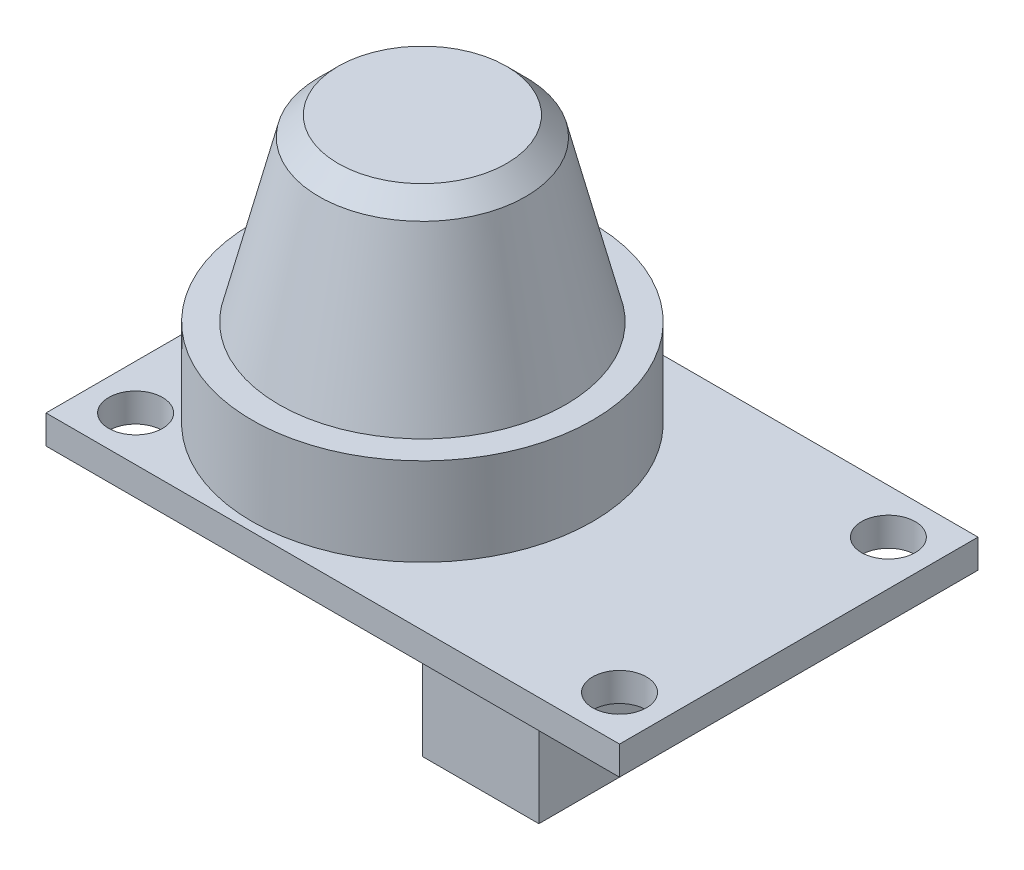
ISO-10303-21;
HEADER;
FILE_DESCRIPTION(('STEP AP214'),'2;1');
FILE_NAME('part.step','',(''),(''),'','','');
FILE_SCHEMA(('AUTOMOTIVE_DESIGN { 1 0 10303 214 1 1 1 1 }'));
ENDSEC;
DATA;
#1=APPLICATION_CONTEXT('core data for automotive mechanical design processes');
#2=APPLICATION_PROTOCOL_DEFINITION('international standard','automotive_design',2000,#1);
#3=PRODUCT_CONTEXT('',#1,'mechanical');
#4=PRODUCT('Part','Part','',(#3));
#5=PRODUCT_RELATED_PRODUCT_CATEGORY('part','',(#4));
#6=PRODUCT_DEFINITION_FORMATION('','',#4);
#7=PRODUCT_DEFINITION_CONTEXT('part definition',#1,'design');
#8=PRODUCT_DEFINITION('design','',#6,#7);
#9=PRODUCT_DEFINITION_SHAPE('','',#8);
#10=(LENGTH_UNIT() NAMED_UNIT(*) SI_UNIT(.MILLI.,.METRE.));
#11=(NAMED_UNIT(*) PLANE_ANGLE_UNIT() SI_UNIT($,.RADIAN.));
#12=(NAMED_UNIT(*) SI_UNIT($,.STERADIAN.) SOLID_ANGLE_UNIT());
#13=UNCERTAINTY_MEASURE_WITH_UNIT(LENGTH_MEASURE(1.E-05),#10,'distance_accuracy_value','');
#14=(GEOMETRIC_REPRESENTATION_CONTEXT(3) GLOBAL_UNCERTAINTY_ASSIGNED_CONTEXT((#13)) GLOBAL_UNIT_ASSIGNED_CONTEXT((#10,
#11,#12)) REPRESENTATION_CONTEXT('',''));
#15=CARTESIAN_POINT('',(0.,0.,0.));
#16=DIRECTION('',(0.,0.,1.));
#17=DIRECTION('',(1.,0.,0.));
#18=AXIS2_PLACEMENT_3D('',#15,#16,#17);
#19=CARTESIAN_POINT('',(0.,0.,0.));
#20=DIRECTION('',(0.,1.,0.));
#21=DIRECTION('',(0.,0.,1.));
#22=AXIS2_PLACEMENT_3D('',#19,#20,#21);
#23=PLANE('',#22);
#24=CARTESIAN_POINT('',(13.5,0.,7.5));
#25=DIRECTION('',(0.,1.,0.));
#26=DIRECTION('',(0.,0.,1.));
#27=AXIS2_PLACEMENT_3D('',#24,#25,#26);
#28=CIRCLE('',#27,1.5);
#29=CARTESIAN_POINT('',(13.5,0.,9.));
#30=VERTEX_POINT('',#29);
#31=EDGE_CURVE('E128',#30,#30,#28,.T.);
#32=ORIENTED_EDGE('',*,*,#31,.T.);
#33=EDGE_LOOP('',(#32));
#34=FACE_BOUND('',#33,.T.);
#35=CARTESIAN_POINT('',(-13.5,0.,7.5));
#36=DIRECTION('',(0.,1.,0.));
#37=DIRECTION('',(0.,0.,1.));
#38=AXIS2_PLACEMENT_3D('',#35,#36,#37);
#39=CIRCLE('',#38,1.5);
#40=CARTESIAN_POINT('',(-13.5,0.,9.));
#41=VERTEX_POINT('',#40);
#42=EDGE_CURVE('E138',#41,#41,#39,.T.);
#43=ORIENTED_EDGE('',*,*,#42,.T.);
#44=EDGE_LOOP('',(#43));
#45=FACE_BOUND('',#44,.T.);
#46=CARTESIAN_POINT('',(13.5,0.,-7.5));
#47=DIRECTION('',(0.,1.,0.));
#48=DIRECTION('',(0.,0.,1.));
#49=AXIS2_PLACEMENT_3D('',#46,#47,#48);
#50=CIRCLE('',#49,1.5);
#51=CARTESIAN_POINT('',(13.5,0.,-6.));
#52=VERTEX_POINT('',#51);
#53=EDGE_CURVE('E143',#52,#52,#50,.T.);
#54=ORIENTED_EDGE('',*,*,#53,.T.);
#55=EDGE_LOOP('',(#54));
#56=FACE_BOUND('',#55,.T.);
#57=CARTESIAN_POINT('',(-13.5,0.,-7.5));
#58=DIRECTION('',(0.,1.,0.));
#59=DIRECTION('',(0.,0.,1.));
#60=AXIS2_PLACEMENT_3D('',#57,#58,#59);
#61=CIRCLE('',#60,1.5);
#62=CARTESIAN_POINT('',(-13.5,0.,-6.));
#63=VERTEX_POINT('',#62);
#64=EDGE_CURVE('E149',#63,#63,#61,.T.);
#65=ORIENTED_EDGE('',*,*,#64,.T.);
#66=EDGE_LOOP('',(#65));
#67=FACE_BOUND('',#66,.T.);
#68=DIRECTION('',(0.,0.,-1.));
#69=VECTOR('',#68,1.);
#70=CARTESIAN_POINT('',(16.,0.,-10.));
#71=LINE('',#70,#69);
#72=CARTESIAN_POINT('',(16.,0.,10.));
#73=VERTEX_POINT('',#72);
#74=CARTESIAN_POINT('',(16.,0.,-10.));
#75=VERTEX_POINT('',#74);
#76=EDGE_CURVE('E155',#73,#75,#71,.T.);
#77=ORIENTED_EDGE('',*,*,#76,.F.);
#78=DIRECTION('',(1.,0.,0.));
#79=VECTOR('',#78,1.);
#80=CARTESIAN_POINT('',(-16.,0.,10.));
#81=LINE('',#80,#79);
#82=CARTESIAN_POINT('',(-16.,0.,10.));
#83=VERTEX_POINT('',#82);
#84=EDGE_CURVE('E162',#83,#73,#81,.T.);
#85=ORIENTED_EDGE('',*,*,#84,.F.);
#86=DIRECTION('',(0.,0.,1.));
#87=VECTOR('',#86,1.);
#88=CARTESIAN_POINT('',(-16.,0.,-10.));
#89=LINE('',#88,#87);
#90=CARTESIAN_POINT('',(-16.,0.,-10.));
#91=VERTEX_POINT('',#90);
#92=EDGE_CURVE('E173',#91,#83,#89,.T.);
#93=ORIENTED_EDGE('',*,*,#92,.F.);
#94=DIRECTION('',(-1.,0.,0.));
#95=VECTOR('',#94,1.);
#96=CARTESIAN_POINT('',(-16.,0.,-10.));
#97=LINE('',#96,#95);
#98=EDGE_CURVE('E171',#75,#91,#97,.T.);
#99=ORIENTED_EDGE('',*,*,#98,.F.);
#100=EDGE_LOOP('',(#77,#85,#93,#99));
#101=FACE_BOUND('',#100,.T.);
#102=DIRECTION('',(0.,0.,1.));
#103=VECTOR('',#102,1.);
#104=CARTESIAN_POINT('',(11.,0.,0.));
#105=LINE('',#104,#103);
#106=CARTESIAN_POINT('',(11.,0.,3.));
#107=VERTEX_POINT('',#106);
#108=CARTESIAN_POINT('',(11.,0.,9.5));
#109=VERTEX_POINT('',#108);
#110=EDGE_CURVE('E127',#107,#109,#105,.T.);
#111=ORIENTED_EDGE('',*,*,#110,.F.);
#112=DIRECTION('',(1.,0.,0.));
#113=VECTOR('',#112,1.);
#114=CARTESIAN_POINT('',(0.,0.,3.));
#115=LINE('',#114,#113);
#116=CARTESIAN_POINT('',(4.5,0.,3.));
#117=VERTEX_POINT('',#116);
#118=EDGE_CURVE('E124',#117,#107,#115,.T.);
#119=ORIENTED_EDGE('',*,*,#118,.F.);
#120=DIRECTION('',(0.,0.,-1.));
#121=VECTOR('',#120,1.);
#122=CARTESIAN_POINT('',(4.5,0.,0.));
#123=LINE('',#122,#121);
#124=CARTESIAN_POINT('',(4.5,0.,9.5));
#125=VERTEX_POINT('',#124);
#126=EDGE_CURVE('E62',#125,#117,#123,.T.);
#127=ORIENTED_EDGE('',*,*,#126,.F.);
#128=DIRECTION('',(-1.,0.,0.));
#129=VECTOR('',#128,1.);
#130=CARTESIAN_POINT('',(0.,0.,9.5));
#131=LINE('',#130,#129);
#132=EDGE_CURVE('E57',#109,#125,#131,.T.);
#133=ORIENTED_EDGE('',*,*,#132,.F.);
#134=EDGE_LOOP('',(#111,#119,#127,#133));
#135=FACE_BOUND('',#134,.T.);
#136=ADVANCED_FACE('F41',(#34,#45,#56,#67,#101,#135),#23,.F.);
#137=CARTESIAN_POINT('',(0.,1.6,0.));
#138=DIRECTION('',(0.,1.,0.));
#139=DIRECTION('',(0.,0.,1.));
#140=AXIS2_PLACEMENT_3D('',#137,#138,#139);
#141=PLANE('',#140);
#142=CARTESIAN_POINT('',(-5.,1.6,0.));
#143=DIRECTION('',(0.,1.,0.));
#144=DIRECTION('',(0.,0.,1.));
#145=AXIS2_PLACEMENT_3D('',#142,#143,#144);
#146=CIRCLE('',#145,9.5);
#147=CARTESIAN_POINT('',(-5.,1.6,9.5));
#148=VERTEX_POINT('',#147);
#149=EDGE_CURVE('E45',#148,#148,#146,.F.);
#150=ORIENTED_EDGE('',*,*,#149,.T.);
#151=EDGE_LOOP('',(#150));
#152=FACE_BOUND('',#151,.T.);
#153=CARTESIAN_POINT('',(-13.5,1.6,7.5));
#154=DIRECTION('',(0.,1.,0.));
#155=DIRECTION('',(0.,0.,1.));
#156=AXIS2_PLACEMENT_3D('',#153,#154,#155);
#157=CIRCLE('',#156,1.5);
#158=CARTESIAN_POINT('',(-13.5,1.6,9.));
#159=VERTEX_POINT('',#158);
#160=EDGE_CURVE('E140',#159,#159,#157,.T.);
#161=ORIENTED_EDGE('',*,*,#160,.F.);
#162=EDGE_LOOP('',(#161));
#163=FACE_BOUND('',#162,.T.);
#164=CARTESIAN_POINT('',(-13.5,1.6,-7.5));
#165=DIRECTION('',(0.,1.,0.));
#166=DIRECTION('',(0.,0.,1.));
#167=AXIS2_PLACEMENT_3D('',#164,#165,#166);
#168=CIRCLE('',#167,1.5);
#169=CARTESIAN_POINT('',(-13.5,1.6,-6.));
#170=VERTEX_POINT('',#169);
#171=EDGE_CURVE('E152',#170,#170,#168,.T.);
#172=ORIENTED_EDGE('',*,*,#171,.F.);
#173=EDGE_LOOP('',(#172));
#174=FACE_BOUND('',#173,.T.);
#175=DIRECTION('',(0.,0.,-1.));
#176=VECTOR('',#175,1.);
#177=CARTESIAN_POINT('',(16.,1.6,-10.));
#178=LINE('',#177,#176);
#179=CARTESIAN_POINT('',(16.,1.6,10.));
#180=VERTEX_POINT('',#179);
#181=CARTESIAN_POINT('',(16.,1.6,-10.));
#182=VERTEX_POINT('',#181);
#183=EDGE_CURVE('E158',#180,#182,#178,.T.);
#184=ORIENTED_EDGE('',*,*,#183,.T.);
#185=DIRECTION('',(-1.,0.,0.));
#186=VECTOR('',#185,1.);
#187=CARTESIAN_POINT('',(-16.,1.6,-10.));
#188=LINE('',#187,#186);
#189=CARTESIAN_POINT('',(-16.,1.6,-10.));
#190=VERTEX_POINT('',#189);
#191=EDGE_CURVE('E161',#182,#190,#188,.T.);
#192=ORIENTED_EDGE('',*,*,#191,.T.);
#193=DIRECTION('',(0.,0.,1.));
#194=VECTOR('',#193,1.);
#195=CARTESIAN_POINT('',(-16.,1.6,-10.));
#196=LINE('',#195,#194);
#197=CARTESIAN_POINT('',(-16.,1.6,10.));
#198=VERTEX_POINT('',#197);
#199=EDGE_CURVE('E164',#190,#198,#196,.T.);
#200=ORIENTED_EDGE('',*,*,#199,.T.);
#201=DIRECTION('',(1.,0.,0.));
#202=VECTOR('',#201,1.);
#203=CARTESIAN_POINT('',(-16.,1.6,10.));
#204=LINE('',#203,#202);
#205=EDGE_CURVE('E166',#198,#180,#204,.T.);
#206=ORIENTED_EDGE('',*,*,#205,.T.);
#207=EDGE_LOOP('',(#184,#192,#200,#206));
#208=FACE_BOUND('',#207,.T.);
#209=CARTESIAN_POINT('',(13.5,1.6,-7.5));
#210=DIRECTION('',(0.,1.,0.));
#211=DIRECTION('',(0.,0.,1.));
#212=AXIS2_PLACEMENT_3D('',#209,#210,#211);
#213=CIRCLE('',#212,1.5);
#214=CARTESIAN_POINT('',(13.5,1.6,-6.));
#215=VERTEX_POINT('',#214);
#216=EDGE_CURVE('E146',#215,#215,#213,.T.);
#217=ORIENTED_EDGE('',*,*,#216,.F.);
#218=EDGE_LOOP('',(#217));
#219=FACE_BOUND('',#218,.T.);
#220=CARTESIAN_POINT('',(13.5,1.6,7.5));
#221=DIRECTION('',(0.,1.,0.));
#222=DIRECTION('',(0.,0.,1.));
#223=AXIS2_PLACEMENT_3D('',#220,#221,#222);
#224=CIRCLE('',#223,1.5);
#225=CARTESIAN_POINT('',(13.5,1.6,9.));
#226=VERTEX_POINT('',#225);
#227=EDGE_CURVE('E131',#226,#226,#224,.T.);
#228=ORIENTED_EDGE('',*,*,#227,.F.);
#229=EDGE_LOOP('',(#228));
#230=FACE_BOUND('',#229,.T.);
#231=ADVANCED_FACE('F200',(#152,#163,#174,#208,#219,#230),#141,.T.);
#232=CARTESIAN_POINT('',(16.,1.6,-10.));
#233=DIRECTION('',(-1.,0.,0.));
#234=DIRECTION('',(0.,0.,1.));
#235=AXIS2_PLACEMENT_3D('',#232,#233,#234);
#236=PLANE('',#235);
#237=ORIENTED_EDGE('',*,*,#76,.T.);
#238=DIRECTION('',(0.,-1.,0.));
#239=VECTOR('',#238,1.);
#240=CARTESIAN_POINT('',(16.,1.6,-10.));
#241=LINE('',#240,#239);
#242=EDGE_CURVE('E11',#182,#75,#241,.T.);
#243=ORIENTED_EDGE('',*,*,#242,.F.);
#244=ORIENTED_EDGE('',*,*,#183,.F.);
#245=DIRECTION('',(0.,-1.,0.));
#246=VECTOR('',#245,1.);
#247=CARTESIAN_POINT('',(16.,1.6,10.));
#248=LINE('',#247,#246);
#249=EDGE_CURVE('E168',#180,#73,#248,.T.);
#250=ORIENTED_EDGE('',*,*,#249,.T.);
#251=EDGE_LOOP('',(#237,#243,#244,#250));
#252=FACE_BOUND('',#251,.T.);
#253=ADVANCED_FACE('F43',(#252),#236,.F.);
#254=CARTESIAN_POINT('',(-16.,1.6,-10.));
#255=DIRECTION('',(0.,0.,1.));
#256=DIRECTION('',(1.,0.,0.));
#257=AXIS2_PLACEMENT_3D('',#254,#255,#256);
#258=PLANE('',#257);
#259=ORIENTED_EDGE('',*,*,#98,.T.);
#260=DIRECTION('',(0.,-1.,0.));
#261=VECTOR('',#260,1.);
#262=CARTESIAN_POINT('',(-16.,1.6,-10.));
#263=LINE('',#262,#261);
#264=EDGE_CURVE('E50',#190,#91,#263,.T.);
#265=ORIENTED_EDGE('',*,*,#264,.F.);
#266=ORIENTED_EDGE('',*,*,#191,.F.);
#267=ORIENTED_EDGE('',*,*,#242,.T.);
#268=EDGE_LOOP('',(#259,#265,#266,#267));
#269=FACE_BOUND('',#268,.T.);
#270=ADVANCED_FACE('F202',(#269),#258,.F.);
#271=CARTESIAN_POINT('',(-16.,1.6,-10.));
#272=DIRECTION('',(1.,0.,0.));
#273=DIRECTION('',(0.,0.,-1.));
#274=AXIS2_PLACEMENT_3D('',#271,#272,#273);
#275=PLANE('',#274);
#276=ORIENTED_EDGE('',*,*,#92,.T.);
#277=DIRECTION('',(0.,-1.,0.));
#278=VECTOR('',#277,1.);
#279=CARTESIAN_POINT('',(-16.,1.6,10.));
#280=LINE('',#279,#278);
#281=EDGE_CURVE('E178',#198,#83,#280,.T.);
#282=ORIENTED_EDGE('',*,*,#281,.F.);
#283=ORIENTED_EDGE('',*,*,#199,.F.);
#284=ORIENTED_EDGE('',*,*,#264,.T.);
#285=EDGE_LOOP('',(#276,#282,#283,#284));
#286=FACE_BOUND('',#285,.T.);
#287=ADVANCED_FACE('F186',(#286),#275,.F.);
#288=CARTESIAN_POINT('',(-16.,1.6,10.));
#289=DIRECTION('',(0.,0.,-1.));
#290=DIRECTION('',(-1.,0.,0.));
#291=AXIS2_PLACEMENT_3D('',#288,#289,#290);
#292=PLANE('',#291);
#293=ORIENTED_EDGE('',*,*,#84,.T.);
#294=ORIENTED_EDGE('',*,*,#249,.F.);
#295=ORIENTED_EDGE('',*,*,#205,.F.);
#296=ORIENTED_EDGE('',*,*,#281,.T.);
#297=EDGE_LOOP('',(#293,#294,#295,#296));
#298=FACE_BOUND('',#297,.T.);
#299=ADVANCED_FACE('F194',(#298),#292,.F.);
#300=CARTESIAN_POINT('',(-13.5,1.6,-7.5));
#301=DIRECTION('',(0.,-1.,0.));
#302=DIRECTION('',(0.,0.,-1.));
#303=AXIS2_PLACEMENT_3D('',#300,#301,#302);
#304=CYLINDRICAL_SURFACE('',#303,1.5);
#305=ORIENTED_EDGE('',*,*,#171,.T.);
#306=EDGE_LOOP('',(#305));
#307=FACE_BOUND('',#306,.T.);
#308=ORIENTED_EDGE('',*,*,#64,.F.);
#309=EDGE_LOOP('',(#308));
#310=FACE_BOUND('',#309,.T.);
#311=ADVANCED_FACE('F221',(#307,#310),#304,.F.);
#312=CARTESIAN_POINT('',(13.5,1.6,-7.5));
#313=DIRECTION('',(0.,-1.,0.));
#314=DIRECTION('',(0.,0.,-1.));
#315=AXIS2_PLACEMENT_3D('',#312,#313,#314);
#316=CYLINDRICAL_SURFACE('',#315,1.5);
#317=ORIENTED_EDGE('',*,*,#216,.T.);
#318=EDGE_LOOP('',(#317));
#319=FACE_BOUND('',#318,.T.);
#320=ORIENTED_EDGE('',*,*,#53,.F.);
#321=EDGE_LOOP('',(#320));
#322=FACE_BOUND('',#321,.T.);
#323=ADVANCED_FACE('F225',(#319,#322),#316,.F.);
#324=CARTESIAN_POINT('',(-13.5,1.6,7.5));
#325=DIRECTION('',(0.,-1.,0.));
#326=DIRECTION('',(0.,0.,-1.));
#327=AXIS2_PLACEMENT_3D('',#324,#325,#326);
#328=CYLINDRICAL_SURFACE('',#327,1.5);
#329=ORIENTED_EDGE('',*,*,#160,.T.);
#330=EDGE_LOOP('',(#329));
#331=FACE_BOUND('',#330,.T.);
#332=ORIENTED_EDGE('',*,*,#42,.F.);
#333=EDGE_LOOP('',(#332));
#334=FACE_BOUND('',#333,.T.);
#335=ADVANCED_FACE('F230',(#331,#334),#328,.F.);
#336=CARTESIAN_POINT('',(13.5,1.6,7.5));
#337=DIRECTION('',(0.,-1.,0.));
#338=DIRECTION('',(0.,0.,-1.));
#339=AXIS2_PLACEMENT_3D('',#336,#337,#338);
#340=CYLINDRICAL_SURFACE('',#339,1.5);
#341=ORIENTED_EDGE('',*,*,#227,.T.);
#342=EDGE_LOOP('',(#341));
#343=FACE_BOUND('',#342,.T.);
#344=ORIENTED_EDGE('',*,*,#31,.F.);
#345=EDGE_LOOP('',(#344));
#346=FACE_BOUND('',#345,.T.);
#347=ADVANCED_FACE('F237',(#343,#346),#340,.F.);
#348=CARTESIAN_POINT('',(11.,-5.,0.));
#349=DIRECTION('',(-1.,0.,0.));
#350=DIRECTION('',(0.,0.,1.));
#351=AXIS2_PLACEMENT_3D('',#348,#349,#350);
#352=PLANE('',#351);
#353=ORIENTED_EDGE('',*,*,#110,.T.);
#354=DIRECTION('',(0.,1.,0.));
#355=VECTOR('',#354,1.);
#356=CARTESIAN_POINT('',(11.,-5.,9.5));
#357=LINE('',#356,#355);
#358=CARTESIAN_POINT('',(11.,-5.,9.5));
#359=VERTEX_POINT('',#358);
#360=EDGE_CURVE('E108',#359,#109,#357,.T.);
#361=ORIENTED_EDGE('',*,*,#360,.F.);
#362=DIRECTION('',(0.,0.,1.));
#363=VECTOR('',#362,1.);
#364=CARTESIAN_POINT('',(11.,-5.,0.));
#365=LINE('',#364,#363);
#366=CARTESIAN_POINT('',(11.,-5.,3.));
#367=VERTEX_POINT('',#366);
#368=EDGE_CURVE('E115',#367,#359,#365,.T.);
#369=ORIENTED_EDGE('',*,*,#368,.F.);
#370=DIRECTION('',(0.,1.,0.));
#371=VECTOR('',#370,1.);
#372=CARTESIAN_POINT('',(11.,-5.,3.));
#373=LINE('',#372,#371);
#374=EDGE_CURVE('E295',#367,#107,#373,.T.);
#375=ORIENTED_EDGE('',*,*,#374,.T.);
#376=EDGE_LOOP('',(#353,#361,#369,#375));
#377=FACE_BOUND('',#376,.T.);
#378=ADVANCED_FACE('F126',(#377),#352,.F.);
#379=CARTESIAN_POINT('',(0.,-5.,9.5));
#380=DIRECTION('',(0.,0.,-1.));
#381=DIRECTION('',(-1.,0.,0.));
#382=AXIS2_PLACEMENT_3D('',#379,#380,#381);
#383=PLANE('',#382);
#384=ORIENTED_EDGE('',*,*,#132,.T.);
#385=DIRECTION('',(0.,1.,0.));
#386=VECTOR('',#385,1.);
#387=CARTESIAN_POINT('',(4.5,-5.,9.5));
#388=LINE('',#387,#386);
#389=CARTESIAN_POINT('',(4.5,-5.,9.5));
#390=VERTEX_POINT('',#389);
#391=EDGE_CURVE('E111',#390,#125,#388,.T.);
#392=ORIENTED_EDGE('',*,*,#391,.F.);
#393=DIRECTION('',(-1.,0.,0.));
#394=VECTOR('',#393,1.);
#395=CARTESIAN_POINT('',(0.,-5.,9.5));
#396=LINE('',#395,#394);
#397=EDGE_CURVE('E104',#359,#390,#396,.T.);
#398=ORIENTED_EDGE('',*,*,#397,.F.);
#399=ORIENTED_EDGE('',*,*,#360,.T.);
#400=EDGE_LOOP('',(#384,#392,#398,#399));
#401=FACE_BOUND('',#400,.T.);
#402=ADVANCED_FACE('F106',(#401),#383,.F.);
#403=CARTESIAN_POINT('',(4.5,-5.,0.));
#404=DIRECTION('',(1.,0.,0.));
#405=DIRECTION('',(0.,0.,-1.));
#406=AXIS2_PLACEMENT_3D('',#403,#404,#405);
#407=PLANE('',#406);
#408=ORIENTED_EDGE('',*,*,#126,.T.);
#409=DIRECTION('',(0.,1.,0.));
#410=VECTOR('',#409,1.);
#411=CARTESIAN_POINT('',(4.5,-5.,3.));
#412=LINE('',#411,#410);
#413=CARTESIAN_POINT('',(4.5,-5.,3.));
#414=VERTEX_POINT('',#413);
#415=EDGE_CURVE('E133',#414,#117,#412,.T.);
#416=ORIENTED_EDGE('',*,*,#415,.F.);
#417=DIRECTION('',(0.,0.,-1.));
#418=VECTOR('',#417,1.);
#419=CARTESIAN_POINT('',(4.5,-5.,0.));
#420=LINE('',#419,#418);
#421=EDGE_CURVE('E114',#390,#414,#420,.T.);
#422=ORIENTED_EDGE('',*,*,#421,.F.);
#423=ORIENTED_EDGE('',*,*,#391,.T.);
#424=EDGE_LOOP('',(#408,#416,#422,#423));
#425=FACE_BOUND('',#424,.T.);
#426=ADVANCED_FACE('F246',(#425),#407,.F.);
#427=CARTESIAN_POINT('',(0.,-5.,3.));
#428=DIRECTION('',(0.,0.,1.));
#429=DIRECTION('',(1.,0.,0.));
#430=AXIS2_PLACEMENT_3D('',#427,#428,#429);
#431=PLANE('',#430);
#432=ORIENTED_EDGE('',*,*,#118,.T.);
#433=ORIENTED_EDGE('',*,*,#374,.F.);
#434=DIRECTION('',(1.,0.,0.));
#435=VECTOR('',#434,1.);
#436=CARTESIAN_POINT('',(0.,-5.,3.));
#437=LINE('',#436,#435);
#438=EDGE_CURVE('E120',#414,#367,#437,.T.);
#439=ORIENTED_EDGE('',*,*,#438,.F.);
#440=ORIENTED_EDGE('',*,*,#415,.T.);
#441=EDGE_LOOP('',(#432,#433,#439,#440));
#442=FACE_BOUND('',#441,.T.);
#443=ADVANCED_FACE('F249',(#442),#431,.F.);
#444=CARTESIAN_POINT('',(0.,-5.,0.));
#445=DIRECTION('',(0.,-1.,0.));
#446=DIRECTION('',(0.,0.,-1.));
#447=AXIS2_PLACEMENT_3D('',#444,#445,#446);
#448=PLANE('',#447);
#449=ORIENTED_EDGE('',*,*,#368,.T.);
#450=ORIENTED_EDGE('',*,*,#397,.T.);
#451=ORIENTED_EDGE('',*,*,#421,.T.);
#452=ORIENTED_EDGE('',*,*,#438,.T.);
#453=EDGE_LOOP('',(#449,#450,#451,#452));
#454=FACE_BOUND('',#453,.T.);
#455=ADVANCED_FACE('F118',(#454),#448,.T.);
#456=CARTESIAN_POINT('',(-5.,16.5,0.));
#457=DIRECTION('',(0.,-1.,0.));
#458=DIRECTION('',(0.,0.,-1.));
#459=AXIS2_PLACEMENT_3D('',#456,#457,#458);
#460=CYLINDRICAL_SURFACE('',#459,9.5);
#461=CARTESIAN_POINT('',(-4.99999999999997,6.49999999999995,0.));
#462=DIRECTION('',(0.,-1.,0.));
#463=DIRECTION('',(1.,0.,0.));
#464=AXIS2_PLACEMENT_3D('',#461,#462,#463);
#465=CIRCLE('',#464,9.49999999999997);
#466=CARTESIAN_POINT('',(4.5,6.49999999999998,0.));
#467=VERTEX_POINT('',#466);
#468=EDGE_CURVE('E280',#467,#467,#465,.T.);
#469=ORIENTED_EDGE('',*,*,#468,.T.);
#470=EDGE_LOOP('',(#469));
#471=FACE_BOUND('',#470,.T.);
#472=ORIENTED_EDGE('',*,*,#149,.F.);
#473=EDGE_LOOP('',(#472));
#474=FACE_BOUND('',#473,.T.);
#475=ADVANCED_FACE('F256',(#471,#474),#460,.T.);
#476=CARTESIAN_POINT('',(-5.,15.4333333333333,0.));
#477=DIRECTION('',(0.,-1.,0.));
#478=DIRECTION('',(1.,0.,0.));
#479=AXIS2_PLACEMENT_3D('',#476,#477,#478);
#480=CONICAL_SURFACE('',#479,5.76666666666666,0.785398163397447);
#481=CARTESIAN_POINT('',(-5.,16.5,0.));
#482=DIRECTION('',(0.,-1.,0.));
#483=DIRECTION('',(1.,0.,0.));
#484=AXIS2_PLACEMENT_3D('',#481,#482,#483);
#485=CIRCLE('',#484,4.7);
#486=CARTESIAN_POINT('',(-0.300000000000003,16.5,0.));
#487=VERTEX_POINT('',#486);
#488=EDGE_CURVE('E287',#487,#487,#485,.T.);
#489=ORIENTED_EDGE('',*,*,#488,.T.);
#490=EDGE_LOOP('',(#489));
#491=FACE_BOUND('',#490,.T.);
#492=CARTESIAN_POINT('',(-5.,15.4333333333333,0.));
#493=DIRECTION('',(0.,-1.,0.));
#494=DIRECTION('',(1.,0.,0.));
#495=AXIS2_PLACEMENT_3D('',#492,#493,#494);
#496=CIRCLE('',#495,5.76666666666666);
#497=CARTESIAN_POINT('',(0.766666666666658,15.4333333333333,0.));
#498=VERTEX_POINT('',#497);
#499=EDGE_CURVE('E284',#498,#498,#496,.T.);
#500=ORIENTED_EDGE('',*,*,#499,.F.);
#501=EDGE_LOOP('',(#500));
#502=FACE_BOUND('',#501,.T.);
#503=ADVANCED_FACE('F259',(#491,#502),#480,.T.);
#504=CARTESIAN_POINT('',(-5.,15.4333333333333,0.));
#505=DIRECTION('',(0.,-1.,0.));
#506=DIRECTION('',(1.,0.,0.));
#507=AXIS2_PLACEMENT_3D('',#504,#505,#506);
#508=CONICAL_SURFACE('',#507,5.76666666666666,0.244978663126861);
#509=CARTESIAN_POINT('',(-4.99999999999997,6.49999999999995,0.));
#510=DIRECTION('',(0.,-1.,0.));
#511=DIRECTION('',(1.,0.,0.));
#512=AXIS2_PLACEMENT_3D('',#509,#510,#511);
#513=CIRCLE('',#512,7.99999999999997);
#514=CARTESIAN_POINT('',(3.,6.49999999999998,0.));
#515=VERTEX_POINT('',#514);
#516=EDGE_CURVE('E283',#515,#515,#513,.T.);
#517=ORIENTED_EDGE('',*,*,#516,.F.);
#518=EDGE_LOOP('',(#517));
#519=FACE_BOUND('',#518,.T.);
#520=ORIENTED_EDGE('',*,*,#499,.T.);
#521=EDGE_LOOP('',(#520));
#522=FACE_BOUND('',#521,.T.);
#523=ADVANCED_FACE('F268',(#519,#522),#508,.T.);
#524=CARTESIAN_POINT('',(0.,6.49999999999999,0.));
#525=DIRECTION('',(0.,-1.,0.));
#526=DIRECTION('',(1.,0.,0.));
#527=AXIS2_PLACEMENT_3D('',#524,#525,#526);
#528=PLANE('',#527);
#529=ORIENTED_EDGE('',*,*,#468,.F.);
#530=EDGE_LOOP('',(#529));
#531=FACE_BOUND('',#530,.T.);
#532=ORIENTED_EDGE('',*,*,#516,.T.);
#533=EDGE_LOOP('',(#532));
#534=FACE_BOUND('',#533,.T.);
#535=ADVANCED_FACE('F264',(#531,#534),#528,.F.);
#536=CARTESIAN_POINT('',(-5.,16.5,0.));
#537=DIRECTION('',(0.,1.,0.));
#538=DIRECTION('',(0.,0.,1.));
#539=AXIS2_PLACEMENT_3D('',#536,#537,#538);
#540=PLANE('',#539);
#541=ORIENTED_EDGE('',*,*,#488,.F.);
#542=EDGE_LOOP('',(#541));
#543=FACE_BOUND('',#542,.T.);
#544=ADVANCED_FACE('F261',(#543),#540,.T.);
#545=CLOSED_SHELL('',(#136,#231,#253,#270,#287,#299,#311,#323,#335,#347,#378,#402,#426,#443,
#455,#475,#503,#523,#535,#544));
#546=MANIFOLD_SOLID_BREP('B2',#545);
#547=ADVANCED_BREP_SHAPE_REPRESENTATION('',(#18,#546),#14);
#548=SHAPE_DEFINITION_REPRESENTATION(#9,#547);
ENDSEC;
END-ISO-10303-21;
